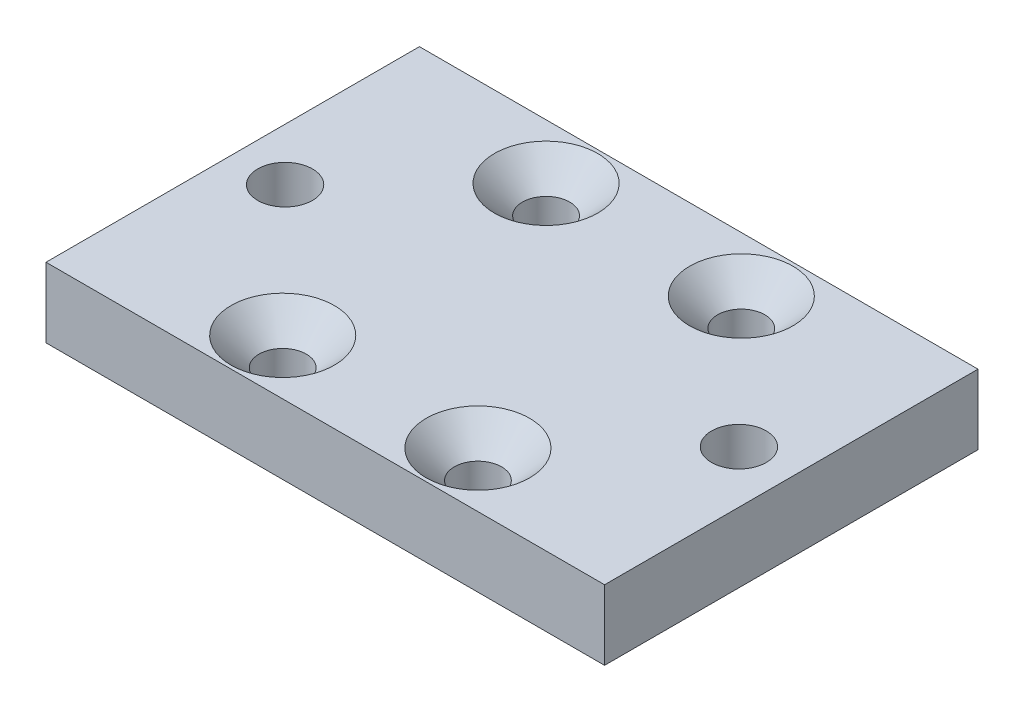
ISO-10303-21;
HEADER;
FILE_DESCRIPTION(('STEP AP214'),'2;1');
FILE_NAME('part.step','',(''),(''),'','','');
FILE_SCHEMA(('AUTOMOTIVE_DESIGN { 1 0 10303 214 1 1 1 1 }'));
ENDSEC;
DATA;
#1=APPLICATION_CONTEXT('core data for automotive mechanical design processes');
#2=APPLICATION_PROTOCOL_DEFINITION('international standard','automotive_design',2000,#1);
#3=PRODUCT_CONTEXT('',#1,'mechanical');
#4=PRODUCT('Part','Part','',(#3));
#5=PRODUCT_RELATED_PRODUCT_CATEGORY('part','',(#4));
#6=PRODUCT_DEFINITION_FORMATION('','',#4);
#7=PRODUCT_DEFINITION_CONTEXT('part definition',#1,'design');
#8=PRODUCT_DEFINITION('design','',#6,#7);
#9=PRODUCT_DEFINITION_SHAPE('','',#8);
#10=(LENGTH_UNIT() NAMED_UNIT(*) SI_UNIT(.MILLI.,.METRE.));
#11=(NAMED_UNIT(*) PLANE_ANGLE_UNIT() SI_UNIT($,.RADIAN.));
#12=(NAMED_UNIT(*) SI_UNIT($,.STERADIAN.) SOLID_ANGLE_UNIT());
#13=UNCERTAINTY_MEASURE_WITH_UNIT(LENGTH_MEASURE(1.E-05),#10,'distance_accuracy_value','');
#14=(GEOMETRIC_REPRESENTATION_CONTEXT(3) GLOBAL_UNCERTAINTY_ASSIGNED_CONTEXT((#13)) GLOBAL_UNIT_ASSIGNED_CONTEXT((#10,
#11,#12)) REPRESENTATION_CONTEXT('',''));
#15=CARTESIAN_POINT('',(0.,0.,0.));
#16=DIRECTION('',(0.,0.,1.));
#17=DIRECTION('',(1.,0.,0.));
#18=AXIS2_PLACEMENT_3D('',#15,#16,#17);
#19=CARTESIAN_POINT('',(0.,0.,0.));
#20=DIRECTION('',(0.,-1.,0.));
#21=DIRECTION('',(0.,0.,-1.));
#22=AXIS2_PLACEMENT_3D('',#19,#20,#21);
#23=PLANE('',#22);
#24=DIRECTION('',(0.,0.,1.));
#25=VECTOR('',#24,1.);
#26=CARTESIAN_POINT('',(0.,0.,0.));
#27=LINE('',#26,#25);
#28=CARTESIAN_POINT('',(0.,0.,-33.9598));
#29=VERTEX_POINT('',#28);
#30=CARTESIAN_POINT('',(0.,0.,0.));
#31=VERTEX_POINT('',#30);
#32=EDGE_CURVE('E96',#29,#31,#27,.T.);
#33=ORIENTED_EDGE('',*,*,#32,.F.);
#34=DIRECTION('',(-1.,0.,0.));
#35=VECTOR('',#34,1.);
#36=CARTESIAN_POINT('',(0.,0.,-33.9598));
#37=LINE('',#36,#35);
#38=CARTESIAN_POINT('',(50.8,0.,-33.9598));
#39=VERTEX_POINT('',#38);
#40=EDGE_CURVE('E72',#39,#29,#37,.T.);
#41=ORIENTED_EDGE('',*,*,#40,.F.);
#42=DIRECTION('',(0.,0.,-1.));
#43=VECTOR('',#42,1.);
#44=CARTESIAN_POINT('',(50.8,0.,0.));
#45=LINE('',#44,#43);
#46=CARTESIAN_POINT('',(50.8,0.,0.));
#47=VERTEX_POINT('',#46);
#48=EDGE_CURVE('E66',#47,#39,#45,.T.);
#49=ORIENTED_EDGE('',*,*,#48,.F.);
#50=DIRECTION('',(1.,0.,0.));
#51=VECTOR('',#50,1.);
#52=CARTESIAN_POINT('',(0.,0.,0.));
#53=LINE('',#52,#51);
#54=EDGE_CURVE('E88',#31,#47,#53,.T.);
#55=ORIENTED_EDGE('',*,*,#54,.F.);
#56=EDGE_LOOP('',(#33,#41,#49,#55));
#57=FACE_BOUND('',#56,.T.);
#58=CARTESIAN_POINT('',(4.7625,0.,-16.9799));
#59=DIRECTION('',(0.,1.,0.));
#60=DIRECTION('',(0.,0.,1.));
#61=AXIS2_PLACEMENT_3D('',#58,#59,#60);
#62=CIRCLE('',#61,2.4892);
#63=CARTESIAN_POINT('',(4.7625,0.,-14.4907));
#64=VERTEX_POINT('',#63);
#65=EDGE_CURVE('E99',#64,#64,#62,.T.);
#66=ORIENTED_EDGE('',*,*,#65,.T.);
#67=EDGE_LOOP('',(#66));
#68=FACE_BOUND('',#67,.T.);
#69=CARTESIAN_POINT('',(46.0375,0.,-16.9799));
#70=DIRECTION('',(0.,1.,0.));
#71=DIRECTION('',(0.,0.,1.));
#72=AXIS2_PLACEMENT_3D('',#69,#70,#71);
#73=CIRCLE('',#72,2.4892);
#74=CARTESIAN_POINT('',(46.0375,0.,-14.4907));
#75=VERTEX_POINT('',#74);
#76=EDGE_CURVE('E113',#75,#75,#73,.T.);
#77=ORIENTED_EDGE('',*,*,#76,.T.);
#78=EDGE_LOOP('',(#77));
#79=FACE_BOUND('',#78,.T.);
#80=CARTESIAN_POINT('',(34.2773,0.,-28.956));
#81=DIRECTION('',(0.,1.,0.));
#82=DIRECTION('',(0.,0.,1.));
#83=AXIS2_PLACEMENT_3D('',#80,#81,#82);
#84=CIRCLE('',#83,2.15);
#85=CARTESIAN_POINT('',(34.2773,0.,-26.806));
#86=VERTEX_POINT('',#85);
#87=EDGE_CURVE('E119',#86,#86,#84,.T.);
#88=ORIENTED_EDGE('',*,*,#87,.T.);
#89=EDGE_LOOP('',(#88));
#90=FACE_BOUND('',#89,.T.);
#91=CARTESIAN_POINT('',(34.2773,0.,-5.0038));
#92=DIRECTION('',(0.,1.,0.));
#93=DIRECTION('',(0.,0.,1.));
#94=AXIS2_PLACEMENT_3D('',#91,#92,#93);
#95=CIRCLE('',#94,2.15);
#96=CARTESIAN_POINT('',(34.2773,0.,-2.8538));
#97=VERTEX_POINT('',#96);
#98=EDGE_CURVE('E130',#97,#97,#95,.T.);
#99=ORIENTED_EDGE('',*,*,#98,.T.);
#100=EDGE_LOOP('',(#99));
#101=FACE_BOUND('',#100,.T.);
#102=CARTESIAN_POINT('',(16.5227,0.,-5.0038));
#103=DIRECTION('',(0.,1.,0.));
#104=DIRECTION('',(0.,0.,1.));
#105=AXIS2_PLACEMENT_3D('',#102,#103,#104);
#106=CIRCLE('',#105,2.15);
#107=CARTESIAN_POINT('',(16.5227,0.,-2.8538));
#108=VERTEX_POINT('',#107);
#109=EDGE_CURVE('E139',#108,#108,#106,.T.);
#110=ORIENTED_EDGE('',*,*,#109,.T.);
#111=EDGE_LOOP('',(#110));
#112=FACE_BOUND('',#111,.T.);
#113=CARTESIAN_POINT('',(16.5227,0.,-28.956));
#114=DIRECTION('',(0.,1.,0.));
#115=DIRECTION('',(0.,0.,1.));
#116=AXIS2_PLACEMENT_3D('',#113,#114,#115);
#117=CIRCLE('',#116,2.15);
#118=CARTESIAN_POINT('',(16.5227,0.,-26.806));
#119=VERTEX_POINT('',#118);
#120=EDGE_CURVE('E148',#119,#119,#117,.T.);
#121=ORIENTED_EDGE('',*,*,#120,.T.);
#122=EDGE_LOOP('',(#121));
#123=FACE_BOUND('',#122,.T.);
#124=ADVANCED_FACE('F32',(#57,#68,#79,#90,#101,#112,#123),#23,.T.);
#125=CARTESIAN_POINT('',(0.,6.35,0.));
#126=DIRECTION('',(1.,0.,0.));
#127=DIRECTION('',(0.,0.,-1.));
#128=AXIS2_PLACEMENT_3D('',#125,#126,#127);
#129=PLANE('',#128);
#130=ORIENTED_EDGE('',*,*,#32,.T.);
#131=DIRECTION('',(0.,-1.,0.));
#132=VECTOR('',#131,1.);
#133=CARTESIAN_POINT('',(0.,6.35,0.));
#134=LINE('',#133,#132);
#135=CARTESIAN_POINT('',(0.,6.35,0.));
#136=VERTEX_POINT('',#135);
#137=EDGE_CURVE('E11',#136,#31,#134,.T.);
#138=ORIENTED_EDGE('',*,*,#137,.F.);
#139=DIRECTION('',(0.,0.,1.));
#140=VECTOR('',#139,1.);
#141=CARTESIAN_POINT('',(0.,6.35,0.));
#142=LINE('',#141,#140);
#143=CARTESIAN_POINT('',(0.,6.35,-33.9598));
#144=VERTEX_POINT('',#143);
#145=EDGE_CURVE('E84',#144,#136,#142,.T.);
#146=ORIENTED_EDGE('',*,*,#145,.F.);
#147=DIRECTION('',(0.,-1.,0.));
#148=VECTOR('',#147,1.);
#149=CARTESIAN_POINT('',(0.,6.35,-33.9598));
#150=LINE('',#149,#148);
#151=EDGE_CURVE('E92',#144,#29,#150,.T.);
#152=ORIENTED_EDGE('',*,*,#151,.T.);
#153=EDGE_LOOP('',(#130,#138,#146,#152));
#154=FACE_BOUND('',#153,.T.);
#155=ADVANCED_FACE('F34',(#154),#129,.F.);
#156=CARTESIAN_POINT('',(0.,6.35,0.));
#157=DIRECTION('',(0.,0.,-1.));
#158=DIRECTION('',(-1.,0.,0.));
#159=AXIS2_PLACEMENT_3D('',#156,#157,#158);
#160=PLANE('',#159);
#161=ORIENTED_EDGE('',*,*,#54,.T.);
#162=DIRECTION('',(0.,-1.,0.));
#163=VECTOR('',#162,1.);
#164=CARTESIAN_POINT('',(50.8,6.35,0.));
#165=LINE('',#164,#163);
#166=CARTESIAN_POINT('',(50.8,6.35,0.));
#167=VERTEX_POINT('',#166);
#168=EDGE_CURVE('E41',#167,#47,#165,.T.);
#169=ORIENTED_EDGE('',*,*,#168,.F.);
#170=DIRECTION('',(1.,0.,0.));
#171=VECTOR('',#170,1.);
#172=CARTESIAN_POINT('',(0.,6.35,0.));
#173=LINE('',#172,#171);
#174=EDGE_CURVE('E79',#136,#167,#173,.T.);
#175=ORIENTED_EDGE('',*,*,#174,.F.);
#176=ORIENTED_EDGE('',*,*,#137,.T.);
#177=EDGE_LOOP('',(#161,#169,#175,#176));
#178=FACE_BOUND('',#177,.T.);
#179=ADVANCED_FACE('F87',(#178),#160,.F.);
#180=CARTESIAN_POINT('',(50.8,6.35,0.));
#181=DIRECTION('',(-1.,0.,0.));
#182=DIRECTION('',(0.,0.,1.));
#183=AXIS2_PLACEMENT_3D('',#180,#181,#182);
#184=PLANE('',#183);
#185=ORIENTED_EDGE('',*,*,#48,.T.);
#186=DIRECTION('',(0.,-1.,0.));
#187=VECTOR('',#186,1.);
#188=CARTESIAN_POINT('',(50.8,6.35,-33.9598));
#189=LINE('',#188,#187);
#190=CARTESIAN_POINT('',(50.8,6.35,-33.9598));
#191=VERTEX_POINT('',#190);
#192=EDGE_CURVE('E89',#191,#39,#189,.T.);
#193=ORIENTED_EDGE('',*,*,#192,.F.);
#194=DIRECTION('',(0.,0.,-1.));
#195=VECTOR('',#194,1.);
#196=CARTESIAN_POINT('',(50.8,6.35,0.));
#197=LINE('',#196,#195);
#198=EDGE_CURVE('E82',#167,#191,#197,.T.);
#199=ORIENTED_EDGE('',*,*,#198,.F.);
#200=ORIENTED_EDGE('',*,*,#168,.T.);
#201=EDGE_LOOP('',(#185,#193,#199,#200));
#202=FACE_BOUND('',#201,.T.);
#203=ADVANCED_FACE('F90',(#202),#184,.F.);
#204=CARTESIAN_POINT('',(0.,6.35,-33.9598));
#205=DIRECTION('',(0.,0.,1.));
#206=DIRECTION('',(1.,0.,0.));
#207=AXIS2_PLACEMENT_3D('',#204,#205,#206);
#208=PLANE('',#207);
#209=ORIENTED_EDGE('',*,*,#40,.T.);
#210=ORIENTED_EDGE('',*,*,#151,.F.);
#211=DIRECTION('',(-1.,0.,0.));
#212=VECTOR('',#211,1.);
#213=CARTESIAN_POINT('',(0.,6.35,-33.9598));
#214=LINE('',#213,#212);
#215=EDGE_CURVE('E49',#191,#144,#214,.T.);
#216=ORIENTED_EDGE('',*,*,#215,.F.);
#217=ORIENTED_EDGE('',*,*,#192,.T.);
#218=EDGE_LOOP('',(#209,#210,#216,#217));
#219=FACE_BOUND('',#218,.T.);
#220=ADVANCED_FACE('F104',(#219),#208,.F.);
#221=CARTESIAN_POINT('',(0.,6.35,0.));
#222=DIRECTION('',(0.,-1.,0.));
#223=DIRECTION('',(0.,0.,-1.));
#224=AXIS2_PLACEMENT_3D('',#221,#222,#223);
#225=PLANE('',#224);
#226=CARTESIAN_POINT('',(16.5227,6.35,-28.956));
#227=DIRECTION('',(0.,1.,0.));
#228=DIRECTION('',(0.,0.,1.));
#229=AXIS2_PLACEMENT_3D('',#226,#227,#228);
#230=CIRCLE('',#229,4.7);
#231=CARTESIAN_POINT('',(16.5227,6.35,-24.256));
#232=VERTEX_POINT('',#231);
#233=EDGE_CURVE('E154',#232,#232,#230,.T.);
#234=ORIENTED_EDGE('',*,*,#233,.F.);
#235=EDGE_LOOP('',(#234));
#236=FACE_BOUND('',#235,.T.);
#237=CARTESIAN_POINT('',(16.5227,6.35,-5.0038));
#238=DIRECTION('',(0.,1.,0.));
#239=DIRECTION('',(0.,0.,1.));
#240=AXIS2_PLACEMENT_3D('',#237,#238,#239);
#241=CIRCLE('',#240,4.7);
#242=CARTESIAN_POINT('',(16.5227,6.35,-0.303800000000001));
#243=VERTEX_POINT('',#242);
#244=EDGE_CURVE('E145',#243,#243,#241,.T.);
#245=ORIENTED_EDGE('',*,*,#244,.F.);
#246=EDGE_LOOP('',(#245));
#247=FACE_BOUND('',#246,.T.);
#248=CARTESIAN_POINT('',(34.2773,6.35,-5.0038));
#249=DIRECTION('',(0.,1.,0.));
#250=DIRECTION('',(0.,0.,1.));
#251=AXIS2_PLACEMENT_3D('',#248,#249,#250);
#252=CIRCLE('',#251,4.7);
#253=CARTESIAN_POINT('',(34.2773,6.35,-0.3038));
#254=VERTEX_POINT('',#253);
#255=EDGE_CURVE('E136',#254,#254,#252,.T.);
#256=ORIENTED_EDGE('',*,*,#255,.F.);
#257=EDGE_LOOP('',(#256));
#258=FACE_BOUND('',#257,.T.);
#259=CARTESIAN_POINT('',(34.2773,6.35,-28.956));
#260=DIRECTION('',(0.,1.,0.));
#261=DIRECTION('',(0.,0.,1.));
#262=AXIS2_PLACEMENT_3D('',#259,#260,#261);
#263=CIRCLE('',#262,4.7);
#264=CARTESIAN_POINT('',(34.2773,6.35,-24.256));
#265=VERTEX_POINT('',#264);
#266=EDGE_CURVE('E127',#265,#265,#263,.T.);
#267=ORIENTED_EDGE('',*,*,#266,.F.);
#268=EDGE_LOOP('',(#267));
#269=FACE_BOUND('',#268,.T.);
#270=CARTESIAN_POINT('',(46.0375,6.35,-16.9799));
#271=DIRECTION('',(0.,1.,0.));
#272=DIRECTION('',(0.,0.,1.));
#273=AXIS2_PLACEMENT_3D('',#270,#271,#272);
#274=CIRCLE('',#273,2.4892);
#275=CARTESIAN_POINT('',(46.0375,6.35,-14.4907));
#276=VERTEX_POINT('',#275);
#277=EDGE_CURVE('E116',#276,#276,#274,.T.);
#278=ORIENTED_EDGE('',*,*,#277,.F.);
#279=EDGE_LOOP('',(#278));
#280=FACE_BOUND('',#279,.T.);
#281=CARTESIAN_POINT('',(4.7625,6.35,-16.9799));
#282=DIRECTION('',(0.,1.,0.));
#283=DIRECTION('',(0.,0.,1.));
#284=AXIS2_PLACEMENT_3D('',#281,#282,#283);
#285=CIRCLE('',#284,2.4892);
#286=CARTESIAN_POINT('',(4.7625,6.35,-14.4907));
#287=VERTEX_POINT('',#286);
#288=EDGE_CURVE('E110',#287,#287,#285,.T.);
#289=ORIENTED_EDGE('',*,*,#288,.F.);
#290=EDGE_LOOP('',(#289));
#291=FACE_BOUND('',#290,.T.);
#292=ORIENTED_EDGE('',*,*,#145,.T.);
#293=ORIENTED_EDGE('',*,*,#174,.T.);
#294=ORIENTED_EDGE('',*,*,#198,.T.);
#295=ORIENTED_EDGE('',*,*,#215,.T.);
#296=EDGE_LOOP('',(#292,#293,#294,#295));
#297=FACE_BOUND('',#296,.T.);
#298=ADVANCED_FACE('F80',(#236,#247,#258,#269,#280,#291,#297),#225,.F.);
#299=CARTESIAN_POINT('',(4.7625,0.,-16.9799));
#300=DIRECTION('',(0.,1.,0.));
#301=DIRECTION('',(0.,0.,1.));
#302=AXIS2_PLACEMENT_3D('',#299,#300,#301);
#303=CYLINDRICAL_SURFACE('',#302,2.4892);
#304=ORIENTED_EDGE('',*,*,#65,.F.);
#305=EDGE_LOOP('',(#304));
#306=FACE_BOUND('',#305,.T.);
#307=ORIENTED_EDGE('',*,*,#288,.T.);
#308=EDGE_LOOP('',(#307));
#309=FACE_BOUND('',#308,.T.);
#310=ADVANCED_FACE('F162',(#306,#309),#303,.F.);
#311=CARTESIAN_POINT('',(46.0375,0.,-16.9799));
#312=DIRECTION('',(0.,1.,0.));
#313=DIRECTION('',(0.,0.,1.));
#314=AXIS2_PLACEMENT_3D('',#311,#312,#313);
#315=CYLINDRICAL_SURFACE('',#314,2.4892);
#316=ORIENTED_EDGE('',*,*,#76,.F.);
#317=EDGE_LOOP('',(#316));
#318=FACE_BOUND('',#317,.T.);
#319=ORIENTED_EDGE('',*,*,#277,.T.);
#320=EDGE_LOOP('',(#319));
#321=FACE_BOUND('',#320,.T.);
#322=ADVANCED_FACE('F175',(#318,#321),#315,.F.);
#323=CARTESIAN_POINT('',(34.2773,6.35,-28.956));
#324=DIRECTION('',(0.,1.,0.));
#325=DIRECTION('',(0.,0.,1.));
#326=AXIS2_PLACEMENT_3D('',#323,#324,#325);
#327=CYLINDRICAL_SURFACE('',#326,2.15);
#328=ORIENTED_EDGE('',*,*,#87,.F.);
#329=EDGE_LOOP('',(#328));
#330=FACE_BOUND('',#329,.T.);
#331=CARTESIAN_POINT('',(34.2773,3.8,-28.956));
#332=DIRECTION('',(0.,1.,0.));
#333=DIRECTION('',(0.,0.,1.));
#334=AXIS2_PLACEMENT_3D('',#331,#332,#333);
#335=CIRCLE('',#334,2.15);
#336=CARTESIAN_POINT('',(34.2773,3.8,-26.806));
#337=VERTEX_POINT('',#336);
#338=EDGE_CURVE('E124',#337,#337,#335,.T.);
#339=ORIENTED_EDGE('',*,*,#338,.T.);
#340=EDGE_LOOP('',(#339));
#341=FACE_BOUND('',#340,.T.);
#342=ADVANCED_FACE('F181',(#330,#341),#327,.F.);
#343=CARTESIAN_POINT('',(34.2773,6.35,-28.956));
#344=DIRECTION('',(0.,1.,0.));
#345=DIRECTION('',(0.,0.,1.));
#346=AXIS2_PLACEMENT_3D('',#343,#344,#345);
#347=CONICAL_SURFACE('',#346,4.7,0.785398163397449);
#348=ORIENTED_EDGE('',*,*,#338,.F.);
#349=EDGE_LOOP('',(#348));
#350=FACE_BOUND('',#349,.T.);
#351=ORIENTED_EDGE('',*,*,#266,.T.);
#352=EDGE_LOOP('',(#351));
#353=FACE_BOUND('',#352,.T.);
#354=ADVANCED_FACE('F224',(#350,#353),#347,.F.);
#355=CARTESIAN_POINT('',(34.2773,6.35,-5.0038));
#356=DIRECTION('',(0.,1.,0.));
#357=DIRECTION('',(0.,0.,1.));
#358=AXIS2_PLACEMENT_3D('',#355,#356,#357);
#359=CYLINDRICAL_SURFACE('',#358,2.15);
#360=ORIENTED_EDGE('',*,*,#98,.F.);
#361=EDGE_LOOP('',(#360));
#362=FACE_BOUND('',#361,.T.);
#363=CARTESIAN_POINT('',(34.2773,3.8,-5.0038));
#364=DIRECTION('',(0.,1.,0.));
#365=DIRECTION('',(0.,0.,1.));
#366=AXIS2_PLACEMENT_3D('',#363,#364,#365);
#367=CIRCLE('',#366,2.15);
#368=CARTESIAN_POINT('',(34.2773,3.8,-2.8538));
#369=VERTEX_POINT('',#368);
#370=EDGE_CURVE('E133',#369,#369,#367,.T.);
#371=ORIENTED_EDGE('',*,*,#370,.T.);
#372=EDGE_LOOP('',(#371));
#373=FACE_BOUND('',#372,.T.);
#374=ADVANCED_FACE('F234',(#362,#373),#359,.F.);
#375=CARTESIAN_POINT('',(34.2773,6.35,-5.0038));
#376=DIRECTION('',(0.,1.,0.));
#377=DIRECTION('',(0.,0.,1.));
#378=AXIS2_PLACEMENT_3D('',#375,#376,#377);
#379=CONICAL_SURFACE('',#378,4.7,0.785398163397449);
#380=ORIENTED_EDGE('',*,*,#370,.F.);
#381=EDGE_LOOP('',(#380));
#382=FACE_BOUND('',#381,.T.);
#383=ORIENTED_EDGE('',*,*,#255,.T.);
#384=EDGE_LOOP('',(#383));
#385=FACE_BOUND('',#384,.T.);
#386=ADVANCED_FACE('F244',(#382,#385),#379,.F.);
#387=CARTESIAN_POINT('',(16.5227,6.35,-5.0038));
#388=DIRECTION('',(0.,1.,0.));
#389=DIRECTION('',(0.,0.,1.));
#390=AXIS2_PLACEMENT_3D('',#387,#388,#389);
#391=CYLINDRICAL_SURFACE('',#390,2.15);
#392=ORIENTED_EDGE('',*,*,#109,.F.);
#393=EDGE_LOOP('',(#392));
#394=FACE_BOUND('',#393,.T.);
#395=CARTESIAN_POINT('',(16.5227,3.8,-5.0038));
#396=DIRECTION('',(0.,1.,0.));
#397=DIRECTION('',(0.,0.,1.));
#398=AXIS2_PLACEMENT_3D('',#395,#396,#397);
#399=CIRCLE('',#398,2.15);
#400=CARTESIAN_POINT('',(16.5227,3.8,-2.8538));
#401=VERTEX_POINT('',#400);
#402=EDGE_CURVE('E142',#401,#401,#399,.T.);
#403=ORIENTED_EDGE('',*,*,#402,.T.);
#404=EDGE_LOOP('',(#403));
#405=FACE_BOUND('',#404,.T.);
#406=ADVANCED_FACE('F254',(#394,#405),#391,.F.);
#407=CARTESIAN_POINT('',(16.5227,6.35,-5.0038));
#408=DIRECTION('',(0.,1.,0.));
#409=DIRECTION('',(0.,0.,1.));
#410=AXIS2_PLACEMENT_3D('',#407,#408,#409);
#411=CONICAL_SURFACE('',#410,4.7,0.785398163397448);
#412=ORIENTED_EDGE('',*,*,#402,.F.);
#413=EDGE_LOOP('',(#412));
#414=FACE_BOUND('',#413,.T.);
#415=ORIENTED_EDGE('',*,*,#244,.T.);
#416=EDGE_LOOP('',(#415));
#417=FACE_BOUND('',#416,.T.);
#418=ADVANCED_FACE('F264',(#414,#417),#411,.F.);
#419=CARTESIAN_POINT('',(16.5227,6.35,-28.956));
#420=DIRECTION('',(0.,1.,0.));
#421=DIRECTION('',(0.,0.,1.));
#422=AXIS2_PLACEMENT_3D('',#419,#420,#421);
#423=CYLINDRICAL_SURFACE('',#422,2.15);
#424=ORIENTED_EDGE('',*,*,#120,.F.);
#425=EDGE_LOOP('',(#424));
#426=FACE_BOUND('',#425,.T.);
#427=CARTESIAN_POINT('',(16.5227,3.8,-28.956));
#428=DIRECTION('',(0.,1.,0.));
#429=DIRECTION('',(0.,0.,1.));
#430=AXIS2_PLACEMENT_3D('',#427,#428,#429);
#431=CIRCLE('',#430,2.15);
#432=CARTESIAN_POINT('',(16.5227,3.8,-26.806));
#433=VERTEX_POINT('',#432);
#434=EDGE_CURVE('E151',#433,#433,#431,.T.);
#435=ORIENTED_EDGE('',*,*,#434,.T.);
#436=EDGE_LOOP('',(#435));
#437=FACE_BOUND('',#436,.T.);
#438=ADVANCED_FACE('F274',(#426,#437),#423,.F.);
#439=CARTESIAN_POINT('',(16.5227,6.35,-28.956));
#440=DIRECTION('',(0.,1.,0.));
#441=DIRECTION('',(0.,0.,1.));
#442=AXIS2_PLACEMENT_3D('',#439,#440,#441);
#443=CONICAL_SURFACE('',#442,4.7,0.785398163397448);
#444=ORIENTED_EDGE('',*,*,#434,.F.);
#445=EDGE_LOOP('',(#444));
#446=FACE_BOUND('',#445,.T.);
#447=ORIENTED_EDGE('',*,*,#233,.T.);
#448=EDGE_LOOP('',(#447));
#449=FACE_BOUND('',#448,.T.);
#450=ADVANCED_FACE('F158',(#446,#449),#443,.F.);
#451=CLOSED_SHELL('',(#124,#155,#179,#203,#220,#298,#310,#322,#342,#354,#374,#386,#406,#418,
#438,#450));
#452=MANIFOLD_SOLID_BREP('B2',#451);
#453=ADVANCED_BREP_SHAPE_REPRESENTATION('',(#18,#452),#14);
#454=SHAPE_DEFINITION_REPRESENTATION(#9,#453);
ENDSEC;
END-ISO-10303-21;
